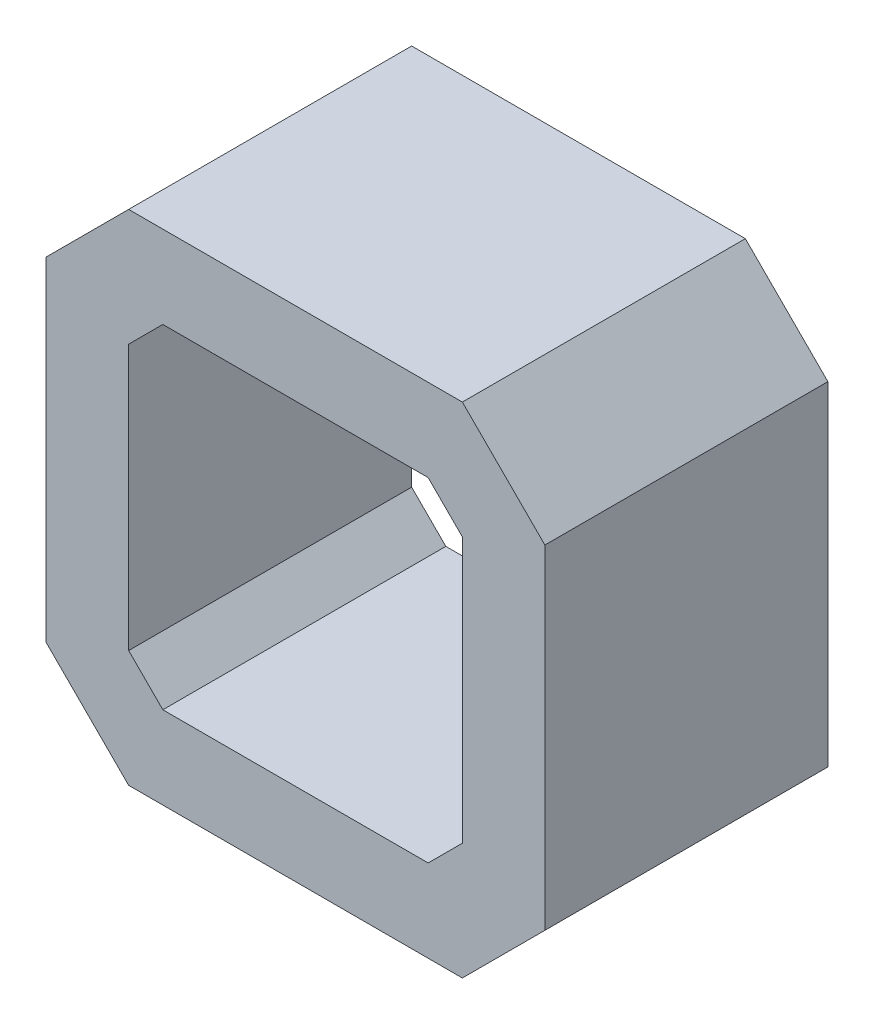
ISO-10303-21;
HEADER;
FILE_DESCRIPTION(('STEP AP214'),'2;1');
FILE_NAME('part.step','',(''),(''),'','','');
FILE_SCHEMA(('AUTOMOTIVE_DESIGN { 1 0 10303 214 1 1 1 1 }'));
ENDSEC;
DATA;
#1=APPLICATION_CONTEXT('core data for automotive mechanical design processes');
#2=APPLICATION_PROTOCOL_DEFINITION('international standard','automotive_design',2000,#1);
#3=PRODUCT_CONTEXT('',#1,'mechanical');
#4=PRODUCT('Part','Part','',(#3));
#5=PRODUCT_RELATED_PRODUCT_CATEGORY('part','',(#4));
#6=PRODUCT_DEFINITION_FORMATION('','',#4);
#7=PRODUCT_DEFINITION_CONTEXT('part definition',#1,'design');
#8=PRODUCT_DEFINITION('design','',#6,#7);
#9=PRODUCT_DEFINITION_SHAPE('','',#8);
#10=(LENGTH_UNIT() NAMED_UNIT(*) SI_UNIT(.MILLI.,.METRE.));
#11=(NAMED_UNIT(*) PLANE_ANGLE_UNIT() SI_UNIT($,.RADIAN.));
#12=(NAMED_UNIT(*) SI_UNIT($,.STERADIAN.) SOLID_ANGLE_UNIT());
#13=UNCERTAINTY_MEASURE_WITH_UNIT(LENGTH_MEASURE(1.E-05),#10,'distance_accuracy_value','');
#14=(GEOMETRIC_REPRESENTATION_CONTEXT(3) GLOBAL_UNCERTAINTY_ASSIGNED_CONTEXT((#13)) GLOBAL_UNIT_ASSIGNED_CONTEXT((#10,
#11,#12)) REPRESENTATION_CONTEXT('',''));
#15=CARTESIAN_POINT('',(0.,0.,0.));
#16=DIRECTION('',(0.,0.,1.));
#17=DIRECTION('',(1.,0.,0.));
#18=AXIS2_PLACEMENT_3D('',#15,#16,#17);
#19=CARTESIAN_POINT('',(-21.15,14.15,24.));
#20=DIRECTION('',(1.,0.,0.));
#21=DIRECTION('',(0.,0.,-1.));
#22=AXIS2_PLACEMENT_3D('',#19,#20,#21);
#23=PLANE('',#22);
#24=DIRECTION('',(0.,-1.,0.));
#25=VECTOR('',#24,1.);
#26=CARTESIAN_POINT('',(-21.15,14.15,0.));
#27=LINE('',#26,#25);
#28=CARTESIAN_POINT('',(-21.15,14.15,0.));
#29=VERTEX_POINT('',#28);
#30=CARTESIAN_POINT('',(-21.15,-14.15,0.));
#31=VERTEX_POINT('',#30);
#32=EDGE_CURVE('E219',#29,#31,#27,.T.);
#33=ORIENTED_EDGE('',*,*,#32,.T.);
#34=DIRECTION('',(0.,0.,-1.));
#35=VECTOR('',#34,1.);
#36=CARTESIAN_POINT('',(-21.15,-14.15,24.));
#37=LINE('',#36,#35);
#38=CARTESIAN_POINT('',(-21.15,-14.15,24.));
#39=VERTEX_POINT('',#38);
#40=EDGE_CURVE('E11',#39,#31,#37,.T.);
#41=ORIENTED_EDGE('',*,*,#40,.F.);
#42=DIRECTION('',(0.,-1.,0.));
#43=VECTOR('',#42,1.);
#44=CARTESIAN_POINT('',(-21.15,14.15,24.));
#45=LINE('',#44,#43);
#46=CARTESIAN_POINT('',(-21.15,14.15,24.));
#47=VERTEX_POINT('',#46);
#48=EDGE_CURVE('E200',#47,#39,#45,.T.);
#49=ORIENTED_EDGE('',*,*,#48,.F.);
#50=DIRECTION('',(0.,0.,-1.));
#51=VECTOR('',#50,1.);
#52=CARTESIAN_POINT('',(-21.15,14.15,24.));
#53=LINE('',#52,#51);
#54=EDGE_CURVE('E218',#47,#29,#53,.T.);
#55=ORIENTED_EDGE('',*,*,#54,.T.);
#56=EDGE_LOOP('',(#33,#41,#49,#55));
#57=FACE_BOUND('',#56,.T.);
#58=ADVANCED_FACE('F34',(#57),#23,.F.);
#59=CARTESIAN_POINT('',(-21.15,-14.15,24.));
#60=DIRECTION('',(0.707106781186548,0.707106781186548,0.));
#61=DIRECTION('',(-0.707106781186548,0.707106781186548,0.));
#62=AXIS2_PLACEMENT_3D('',#59,#60,#61);
#63=PLANE('',#62);
#64=DIRECTION('',(0.707106781186547,-0.707106781186547,0.));
#65=VECTOR('',#64,1.);
#66=CARTESIAN_POINT('',(-21.15,-14.15,0.));
#67=LINE('',#66,#65);
#68=CARTESIAN_POINT('',(-14.15,-21.15,0.));
#69=VERTEX_POINT('',#68);
#70=EDGE_CURVE('E222',#31,#69,#67,.T.);
#71=ORIENTED_EDGE('',*,*,#70,.T.);
#72=DIRECTION('',(0.,0.,-1.));
#73=VECTOR('',#72,1.);
#74=CARTESIAN_POINT('',(-14.15,-21.15,24.));
#75=LINE('',#74,#73);
#76=CARTESIAN_POINT('',(-14.15,-21.15,24.));
#77=VERTEX_POINT('',#76);
#78=EDGE_CURVE('E41',#77,#69,#75,.T.);
#79=ORIENTED_EDGE('',*,*,#78,.F.);
#80=DIRECTION('',(0.707106781186547,-0.707106781186547,0.));
#81=VECTOR('',#80,1.);
#82=CARTESIAN_POINT('',(-21.15,-14.15,24.));
#83=LINE('',#82,#81);
#84=EDGE_CURVE('E203',#39,#77,#83,.T.);
#85=ORIENTED_EDGE('',*,*,#84,.F.);
#86=ORIENTED_EDGE('',*,*,#40,.T.);
#87=EDGE_LOOP('',(#71,#79,#85,#86));
#88=FACE_BOUND('',#87,.T.);
#89=ADVANCED_FACE('F277',(#88),#63,.F.);
#90=CARTESIAN_POINT('',(-14.15,-21.15,24.));
#91=DIRECTION('',(0.,1.,0.));
#92=DIRECTION('',(0.,0.,1.));
#93=AXIS2_PLACEMENT_3D('',#90,#91,#92);
#94=PLANE('',#93);
#95=DIRECTION('',(1.,0.,0.));
#96=VECTOR('',#95,1.);
#97=CARTESIAN_POINT('',(-14.15,-21.15,0.));
#98=LINE('',#97,#96);
#99=CARTESIAN_POINT('',(14.15,-21.15,0.));
#100=VERTEX_POINT('',#99);
#101=EDGE_CURVE('E224',#69,#100,#98,.T.);
#102=ORIENTED_EDGE('',*,*,#101,.T.);
#103=DIRECTION('',(0.,0.,-1.));
#104=VECTOR('',#103,1.);
#105=CARTESIAN_POINT('',(14.15,-21.15,24.));
#106=LINE('',#105,#104);
#107=CARTESIAN_POINT('',(14.15,-21.15,24.));
#108=VERTEX_POINT('',#107);
#109=EDGE_CURVE('E249',#108,#100,#106,.T.);
#110=ORIENTED_EDGE('',*,*,#109,.F.);
#111=DIRECTION('',(1.,0.,0.));
#112=VECTOR('',#111,1.);
#113=CARTESIAN_POINT('',(-14.15,-21.15,24.));
#114=LINE('',#113,#112);
#115=EDGE_CURVE('E206',#77,#108,#114,.T.);
#116=ORIENTED_EDGE('',*,*,#115,.F.);
#117=ORIENTED_EDGE('',*,*,#78,.T.);
#118=EDGE_LOOP('',(#102,#110,#116,#117));
#119=FACE_BOUND('',#118,.T.);
#120=ADVANCED_FACE('F256',(#119),#94,.F.);
#121=CARTESIAN_POINT('',(21.15,-14.15,24.));
#122=DIRECTION('',(-0.707106781186548,0.707106781186548,0.));
#123=DIRECTION('',(-0.707106781186548,-0.707106781186548,0.));
#124=AXIS2_PLACEMENT_3D('',#121,#122,#123);
#125=PLANE('',#124);
#126=DIRECTION('',(0.707106781186547,0.707106781186547,0.));
#127=VECTOR('',#126,1.);
#128=CARTESIAN_POINT('',(21.15,-14.15,0.));
#129=LINE('',#128,#127);
#130=CARTESIAN_POINT('',(21.15,-14.15,0.));
#131=VERTEX_POINT('',#130);
#132=EDGE_CURVE('E226',#100,#131,#129,.T.);
#133=ORIENTED_EDGE('',*,*,#132,.T.);
#134=DIRECTION('',(0.,0.,-1.));
#135=VECTOR('',#134,1.);
#136=CARTESIAN_POINT('',(21.15,-14.15,24.));
#137=LINE('',#136,#135);
#138=CARTESIAN_POINT('',(21.15,-14.15,24.));
#139=VERTEX_POINT('',#138);
#140=EDGE_CURVE('E246',#139,#131,#137,.T.);
#141=ORIENTED_EDGE('',*,*,#140,.F.);
#142=DIRECTION('',(0.707106781186547,0.707106781186547,0.));
#143=VECTOR('',#142,1.);
#144=CARTESIAN_POINT('',(21.15,-14.15,24.));
#145=LINE('',#144,#143);
#146=EDGE_CURVE('E208',#108,#139,#145,.T.);
#147=ORIENTED_EDGE('',*,*,#146,.F.);
#148=ORIENTED_EDGE('',*,*,#109,.T.);
#149=EDGE_LOOP('',(#133,#141,#147,#148));
#150=FACE_BOUND('',#149,.T.);
#151=ADVANCED_FACE('F265',(#150),#125,.F.);
#152=CARTESIAN_POINT('',(21.15,14.15,24.));
#153=DIRECTION('',(-1.,0.,0.));
#154=DIRECTION('',(0.,-1.,0.));
#155=AXIS2_PLACEMENT_3D('',#152,#153,#154);
#156=PLANE('',#155);
#157=DIRECTION('',(0.,1.,0.));
#158=VECTOR('',#157,1.);
#159=CARTESIAN_POINT('',(21.15,14.15,0.));
#160=LINE('',#159,#158);
#161=CARTESIAN_POINT('',(21.15,14.15,0.));
#162=VERTEX_POINT('',#161);
#163=EDGE_CURVE('E228',#131,#162,#160,.T.);
#164=ORIENTED_EDGE('',*,*,#163,.T.);
#165=DIRECTION('',(0.,0.,-1.));
#166=VECTOR('',#165,1.);
#167=CARTESIAN_POINT('',(21.15,14.15,24.));
#168=LINE('',#167,#166);
#169=CARTESIAN_POINT('',(21.15,14.15,24.));
#170=VERTEX_POINT('',#169);
#171=EDGE_CURVE('E243',#170,#162,#168,.T.);
#172=ORIENTED_EDGE('',*,*,#171,.F.);
#173=DIRECTION('',(0.,1.,0.));
#174=VECTOR('',#173,1.);
#175=CARTESIAN_POINT('',(21.15,14.15,24.));
#176=LINE('',#175,#174);
#177=EDGE_CURVE('E210',#139,#170,#176,.T.);
#178=ORIENTED_EDGE('',*,*,#177,.F.);
#179=ORIENTED_EDGE('',*,*,#140,.T.);
#180=EDGE_LOOP('',(#164,#172,#178,#179));
#181=FACE_BOUND('',#180,.T.);
#182=ADVANCED_FACE('F269',(#181),#156,.F.);
#183=CARTESIAN_POINT('',(14.15,21.15,24.));
#184=DIRECTION('',(-0.707106781186548,-0.707106781186548,0.));
#185=DIRECTION('',(0.707106781186548,-0.707106781186548,0.));
#186=AXIS2_PLACEMENT_3D('',#183,#184,#185);
#187=PLANE('',#186);
#188=DIRECTION('',(-0.707106781186547,0.707106781186547,0.));
#189=VECTOR('',#188,1.);
#190=CARTESIAN_POINT('',(14.15,21.15,0.));
#191=LINE('',#190,#189);
#192=CARTESIAN_POINT('',(14.15,21.15,0.));
#193=VERTEX_POINT('',#192);
#194=EDGE_CURVE('E230',#162,#193,#191,.T.);
#195=ORIENTED_EDGE('',*,*,#194,.T.);
#196=DIRECTION('',(0.,0.,-1.));
#197=VECTOR('',#196,1.);
#198=CARTESIAN_POINT('',(14.15,21.15,24.));
#199=LINE('',#198,#197);
#200=CARTESIAN_POINT('',(14.15,21.15,24.));
#201=VERTEX_POINT('',#200);
#202=EDGE_CURVE('E240',#201,#193,#199,.T.);
#203=ORIENTED_EDGE('',*,*,#202,.F.);
#204=DIRECTION('',(-0.707106781186547,0.707106781186547,0.));
#205=VECTOR('',#204,1.);
#206=CARTESIAN_POINT('',(14.15,21.15,24.));
#207=LINE('',#206,#205);
#208=EDGE_CURVE('E212',#170,#201,#207,.T.);
#209=ORIENTED_EDGE('',*,*,#208,.F.);
#210=ORIENTED_EDGE('',*,*,#171,.T.);
#211=EDGE_LOOP('',(#195,#203,#209,#210));
#212=FACE_BOUND('',#211,.T.);
#213=ADVANCED_FACE('F290',(#212),#187,.F.);
#214=CARTESIAN_POINT('',(-14.15,21.15,24.));
#215=DIRECTION('',(0.,-1.,0.));
#216=DIRECTION('',(0.,0.,-1.));
#217=AXIS2_PLACEMENT_3D('',#214,#215,#216);
#218=PLANE('',#217);
#219=DIRECTION('',(-1.,0.,0.));
#220=VECTOR('',#219,1.);
#221=CARTESIAN_POINT('',(-14.15,21.15,0.));
#222=LINE('',#221,#220);
#223=CARTESIAN_POINT('',(-14.15,21.15,0.));
#224=VERTEX_POINT('',#223);
#225=EDGE_CURVE('E232',#193,#224,#222,.T.);
#226=ORIENTED_EDGE('',*,*,#225,.T.);
#227=DIRECTION('',(0.,0.,-1.));
#228=VECTOR('',#227,1.);
#229=CARTESIAN_POINT('',(-14.15,21.15,24.));
#230=LINE('',#229,#228);
#231=CARTESIAN_POINT('',(-14.15,21.15,24.));
#232=VERTEX_POINT('',#231);
#233=EDGE_CURVE('E237',#232,#224,#230,.T.);
#234=ORIENTED_EDGE('',*,*,#233,.F.);
#235=DIRECTION('',(-1.,0.,0.));
#236=VECTOR('',#235,1.);
#237=CARTESIAN_POINT('',(-14.15,21.15,24.));
#238=LINE('',#237,#236);
#239=EDGE_CURVE('E214',#201,#232,#238,.T.);
#240=ORIENTED_EDGE('',*,*,#239,.F.);
#241=ORIENTED_EDGE('',*,*,#202,.T.);
#242=EDGE_LOOP('',(#226,#234,#240,#241));
#243=FACE_BOUND('',#242,.T.);
#244=ADVANCED_FACE('F288',(#243),#218,.F.);
#245=CARTESIAN_POINT('',(-14.15,21.15,24.));
#246=DIRECTION('',(0.707106781186548,-0.707106781186548,0.));
#247=DIRECTION('',(0.707106781186548,0.707106781186548,0.));
#248=AXIS2_PLACEMENT_3D('',#245,#246,#247);
#249=PLANE('',#248);
#250=DIRECTION('',(-0.707106781186547,-0.707106781186547,0.));
#251=VECTOR('',#250,1.);
#252=CARTESIAN_POINT('',(-14.15,21.15,0.));
#253=LINE('',#252,#251);
#254=EDGE_CURVE('E204',#224,#29,#253,.T.);
#255=ORIENTED_EDGE('',*,*,#254,.T.);
#256=ORIENTED_EDGE('',*,*,#54,.F.);
#257=DIRECTION('',(-0.707106781186547,-0.707106781186547,0.));
#258=VECTOR('',#257,1.);
#259=CARTESIAN_POINT('',(-14.15,21.15,24.));
#260=LINE('',#259,#258);
#261=EDGE_CURVE('E216',#232,#47,#260,.T.);
#262=ORIENTED_EDGE('',*,*,#261,.F.);
#263=ORIENTED_EDGE('',*,*,#233,.T.);
#264=EDGE_LOOP('',(#255,#256,#262,#263));
#265=FACE_BOUND('',#264,.T.);
#266=ADVANCED_FACE('F283',(#265),#249,.F.);
#267=CARTESIAN_POINT('',(0.,0.,24.));
#268=DIRECTION('',(0.,0.,1.));
#269=DIRECTION('',(1.,0.,0.));
#270=AXIS2_PLACEMENT_3D('',#267,#268,#269);
#271=PLANE('',#270);
#272=DIRECTION('',(0.,-1.,0.));
#273=VECTOR('',#272,1.);
#274=CARTESIAN_POINT('',(-14.15,14.15,24.));
#275=LINE('',#274,#273);
#276=CARTESIAN_POINT('',(-14.15,11.2505050633883,24.));
#277=VERTEX_POINT('',#276);
#278=CARTESIAN_POINT('',(-14.15,-11.2505050633883,24.));
#279=VERTEX_POINT('',#278);
#280=EDGE_CURVE('E171',#277,#279,#275,.T.);
#281=ORIENTED_EDGE('',*,*,#280,.F.);
#282=DIRECTION('',(-0.707106781186548,-0.707106781186548,0.));
#283=VECTOR('',#282,1.);
#284=CARTESIAN_POINT('',(-9.20025253169417,16.2002525316942,24.));
#285=LINE('',#284,#283);
#286=CARTESIAN_POINT('',(-11.2505050633883,14.15,24.));
#287=VERTEX_POINT('',#286);
#288=EDGE_CURVE('E152',#287,#277,#285,.T.);
#289=ORIENTED_EDGE('',*,*,#288,.F.);
#290=DIRECTION('',(-1.,0.,0.));
#291=VECTOR('',#290,1.);
#292=CARTESIAN_POINT('',(-14.15,14.15,24.));
#293=LINE('',#292,#291);
#294=CARTESIAN_POINT('',(11.2505050633883,14.15,24.));
#295=VERTEX_POINT('',#294);
#296=EDGE_CURVE('E197',#295,#287,#293,.T.);
#297=ORIENTED_EDGE('',*,*,#296,.F.);
#298=DIRECTION('',(-0.707106781186548,0.707106781186548,0.));
#299=VECTOR('',#298,1.);
#300=CARTESIAN_POINT('',(9.20025253169416,16.2002525316942,24.));
#301=LINE('',#300,#299);
#302=CARTESIAN_POINT('',(14.15,11.2505050633883,24.));
#303=VERTEX_POINT('',#302);
#304=EDGE_CURVE('E195',#303,#295,#301,.T.);
#305=ORIENTED_EDGE('',*,*,#304,.F.);
#306=DIRECTION('',(0.,1.,0.));
#307=VECTOR('',#306,1.);
#308=CARTESIAN_POINT('',(14.15,14.15,24.));
#309=LINE('',#308,#307);
#310=CARTESIAN_POINT('',(14.15,-11.2505050633883,24.));
#311=VERTEX_POINT('',#310);
#312=EDGE_CURVE('E193',#311,#303,#309,.T.);
#313=ORIENTED_EDGE('',*,*,#312,.F.);
#314=DIRECTION('',(0.707106781186548,0.707106781186548,0.));
#315=VECTOR('',#314,1.);
#316=CARTESIAN_POINT('',(16.2002525316942,-9.20025253169417,24.));
#317=LINE('',#316,#315);
#318=CARTESIAN_POINT('',(11.2505050633883,-14.15,24.));
#319=VERTEX_POINT('',#318);
#320=EDGE_CURVE('E191',#319,#311,#317,.T.);
#321=ORIENTED_EDGE('',*,*,#320,.F.);
#322=DIRECTION('',(1.,0.,0.));
#323=VECTOR('',#322,1.);
#324=CARTESIAN_POINT('',(-14.15,-14.15,24.));
#325=LINE('',#324,#323);
#326=CARTESIAN_POINT('',(-11.2505050633883,-14.15,24.));
#327=VERTEX_POINT('',#326);
#328=EDGE_CURVE('E189',#327,#319,#325,.T.);
#329=ORIENTED_EDGE('',*,*,#328,.F.);
#330=DIRECTION('',(0.707106781186548,-0.707106781186548,0.));
#331=VECTOR('',#330,1.);
#332=CARTESIAN_POINT('',(-16.2002525316942,-9.20025253169417,24.));
#333=LINE('',#332,#331);
#334=EDGE_CURVE('E173',#279,#327,#333,.T.);
#335=ORIENTED_EDGE('',*,*,#334,.F.);
#336=EDGE_LOOP('',(#281,#289,#297,#305,#313,#321,#329,#335));
#337=FACE_BOUND('',#336,.T.);
#338=ORIENTED_EDGE('',*,*,#48,.T.);
#339=ORIENTED_EDGE('',*,*,#84,.T.);
#340=ORIENTED_EDGE('',*,*,#115,.T.);
#341=ORIENTED_EDGE('',*,*,#146,.T.);
#342=ORIENTED_EDGE('',*,*,#177,.T.);
#343=ORIENTED_EDGE('',*,*,#208,.T.);
#344=ORIENTED_EDGE('',*,*,#239,.T.);
#345=ORIENTED_EDGE('',*,*,#261,.T.);
#346=EDGE_LOOP('',(#338,#339,#340,#341,#342,#343,#344,#345));
#347=FACE_BOUND('',#346,.T.);
#348=ADVANCED_FACE('F273',(#337,#347),#271,.T.);
#349=CARTESIAN_POINT('',(0.,0.,0.));
#350=DIRECTION('',(0.,0.,1.));
#351=DIRECTION('',(1.,0.,0.));
#352=AXIS2_PLACEMENT_3D('',#349,#350,#351);
#353=PLANE('',#352);
#354=DIRECTION('',(-0.707106781186548,-0.707106781186548,0.));
#355=VECTOR('',#354,1.);
#356=CARTESIAN_POINT('',(-9.20025253169417,16.2002525316942,0.));
#357=LINE('',#356,#355);
#358=CARTESIAN_POINT('',(-11.2505050633883,14.15,0.));
#359=VERTEX_POINT('',#358);
#360=CARTESIAN_POINT('',(-14.15,11.2505050633883,0.));
#361=VERTEX_POINT('',#360);
#362=EDGE_CURVE('E149',#359,#361,#357,.T.);
#363=ORIENTED_EDGE('',*,*,#362,.T.);
#364=DIRECTION('',(0.,-1.,0.));
#365=VECTOR('',#364,1.);
#366=CARTESIAN_POINT('',(-14.15,14.15,0.));
#367=LINE('',#366,#365);
#368=CARTESIAN_POINT('',(-14.15,-11.2505050633883,0.));
#369=VERTEX_POINT('',#368);
#370=EDGE_CURVE('E158',#361,#369,#367,.T.);
#371=ORIENTED_EDGE('',*,*,#370,.T.);
#372=DIRECTION('',(0.707106781186548,-0.707106781186548,0.));
#373=VECTOR('',#372,1.);
#374=CARTESIAN_POINT('',(-16.2002525316942,-9.20025253169417,0.));
#375=LINE('',#374,#373);
#376=CARTESIAN_POINT('',(-11.2505050633883,-14.15,0.));
#377=VERTEX_POINT('',#376);
#378=EDGE_CURVE('E164',#369,#377,#375,.T.);
#379=ORIENTED_EDGE('',*,*,#378,.T.);
#380=DIRECTION('',(1.,0.,0.));
#381=VECTOR('',#380,1.);
#382=CARTESIAN_POINT('',(-14.15,-14.15,0.));
#383=LINE('',#382,#381);
#384=CARTESIAN_POINT('',(11.2505050633883,-14.15,0.));
#385=VERTEX_POINT('',#384);
#386=EDGE_CURVE('E56',#377,#385,#383,.T.);
#387=ORIENTED_EDGE('',*,*,#386,.T.);
#388=DIRECTION('',(0.707106781186548,0.707106781186548,0.));
#389=VECTOR('',#388,1.);
#390=CARTESIAN_POINT('',(16.2002525316942,-9.20025253169417,0.));
#391=LINE('',#390,#389);
#392=CARTESIAN_POINT('',(14.15,-11.2505050633883,0.));
#393=VERTEX_POINT('',#392);
#394=EDGE_CURVE('E183',#385,#393,#391,.T.);
#395=ORIENTED_EDGE('',*,*,#394,.T.);
#396=DIRECTION('',(0.,1.,0.));
#397=VECTOR('',#396,1.);
#398=CARTESIAN_POINT('',(14.15,14.15,0.));
#399=LINE('',#398,#397);
#400=CARTESIAN_POINT('',(14.15,11.2505050633883,0.));
#401=VERTEX_POINT('',#400);
#402=EDGE_CURVE('E180',#393,#401,#399,.T.);
#403=ORIENTED_EDGE('',*,*,#402,.T.);
#404=DIRECTION('',(-0.707106781186548,0.707106781186548,0.));
#405=VECTOR('',#404,1.);
#406=CARTESIAN_POINT('',(9.20025253169416,16.2002525316942,0.));
#407=LINE('',#406,#405);
#408=CARTESIAN_POINT('',(11.2505050633883,14.15,0.));
#409=VERTEX_POINT('',#408);
#410=EDGE_CURVE('E175',#401,#409,#407,.T.);
#411=ORIENTED_EDGE('',*,*,#410,.T.);
#412=DIRECTION('',(-1.,0.,0.));
#413=VECTOR('',#412,1.);
#414=CARTESIAN_POINT('',(-14.15,14.15,0.));
#415=LINE('',#414,#413);
#416=EDGE_CURVE('E170',#409,#359,#415,.T.);
#417=ORIENTED_EDGE('',*,*,#416,.T.);
#418=EDGE_LOOP('',(#363,#371,#379,#387,#395,#403,#411,#417));
#419=FACE_BOUND('',#418,.T.);
#420=ORIENTED_EDGE('',*,*,#32,.F.);
#421=ORIENTED_EDGE('',*,*,#254,.F.);
#422=ORIENTED_EDGE('',*,*,#225,.F.);
#423=ORIENTED_EDGE('',*,*,#194,.F.);
#424=ORIENTED_EDGE('',*,*,#163,.F.);
#425=ORIENTED_EDGE('',*,*,#132,.F.);
#426=ORIENTED_EDGE('',*,*,#101,.F.);
#427=ORIENTED_EDGE('',*,*,#70,.F.);
#428=EDGE_LOOP('',(#420,#421,#422,#423,#424,#425,#426,#427));
#429=FACE_BOUND('',#428,.T.);
#430=ADVANCED_FACE('F166',(#419,#429),#353,.F.);
#431=CARTESIAN_POINT('',(-14.15,14.15,24.));
#432=DIRECTION('',(1.,0.,0.));
#433=DIRECTION('',(0.,0.,-1.));
#434=AXIS2_PLACEMENT_3D('',#431,#432,#433);
#435=PLANE('',#434);
#436=ORIENTED_EDGE('',*,*,#370,.F.);
#437=DIRECTION('',(0.,0.,-1.));
#438=VECTOR('',#437,1.);
#439=CARTESIAN_POINT('',(-14.15,11.2505050633883,24.));
#440=LINE('',#439,#438);
#441=EDGE_CURVE('E145',#277,#361,#440,.T.);
#442=ORIENTED_EDGE('',*,*,#441,.F.);
#443=ORIENTED_EDGE('',*,*,#280,.T.);
#444=DIRECTION('',(0.,0.,-1.));
#445=VECTOR('',#444,1.);
#446=CARTESIAN_POINT('',(-14.15,-11.2505050633883,24.));
#447=LINE('',#446,#445);
#448=EDGE_CURVE('E161',#279,#369,#447,.T.);
#449=ORIENTED_EDGE('',*,*,#448,.T.);
#450=EDGE_LOOP('',(#436,#442,#443,#449));
#451=FACE_BOUND('',#450,.T.);
#452=ADVANCED_FACE('F159',(#451),#435,.T.);
#453=CARTESIAN_POINT('',(-16.2002525316942,-9.20025253169417,24.));
#454=DIRECTION('',(0.707106781186548,0.707106781186548,0.));
#455=DIRECTION('',(-0.707106781186548,0.707106781186548,0.));
#456=AXIS2_PLACEMENT_3D('',#453,#454,#455);
#457=PLANE('',#456);
#458=ORIENTED_EDGE('',*,*,#378,.F.);
#459=ORIENTED_EDGE('',*,*,#448,.F.);
#460=ORIENTED_EDGE('',*,*,#334,.T.);
#461=DIRECTION('',(0.,0.,-1.));
#462=VECTOR('',#461,1.);
#463=CARTESIAN_POINT('',(-11.2505050633883,-14.15,24.));
#464=LINE('',#463,#462);
#465=EDGE_CURVE('E446',#327,#377,#464,.T.);
#466=ORIENTED_EDGE('',*,*,#465,.T.);
#467=EDGE_LOOP('',(#458,#459,#460,#466));
#468=FACE_BOUND('',#467,.T.);
#469=ADVANCED_FACE('F361',(#468),#457,.T.);
#470=CARTESIAN_POINT('',(-14.15,-14.15,24.));
#471=DIRECTION('',(0.,1.,0.));
#472=DIRECTION('',(0.,0.,1.));
#473=AXIS2_PLACEMENT_3D('',#470,#471,#472);
#474=PLANE('',#473);
#475=ORIENTED_EDGE('',*,*,#386,.F.);
#476=ORIENTED_EDGE('',*,*,#465,.F.);
#477=ORIENTED_EDGE('',*,*,#328,.T.);
#478=DIRECTION('',(0.,0.,-1.));
#479=VECTOR('',#478,1.);
#480=CARTESIAN_POINT('',(11.2505050633883,-14.15,24.));
#481=LINE('',#480,#479);
#482=EDGE_CURVE('E444',#319,#385,#481,.T.);
#483=ORIENTED_EDGE('',*,*,#482,.T.);
#484=EDGE_LOOP('',(#475,#476,#477,#483));
#485=FACE_BOUND('',#484,.T.);
#486=ADVANCED_FACE('F370',(#485),#474,.T.);
#487=CARTESIAN_POINT('',(16.2002525316942,-9.20025253169417,24.));
#488=DIRECTION('',(-0.707106781186548,0.707106781186548,0.));
#489=DIRECTION('',(-0.707106781186548,-0.707106781186548,0.));
#490=AXIS2_PLACEMENT_3D('',#487,#488,#489);
#491=PLANE('',#490);
#492=ORIENTED_EDGE('',*,*,#394,.F.);
#493=ORIENTED_EDGE('',*,*,#482,.F.);
#494=ORIENTED_EDGE('',*,*,#320,.T.);
#495=DIRECTION('',(0.,0.,-1.));
#496=VECTOR('',#495,1.);
#497=CARTESIAN_POINT('',(14.15,-11.2505050633883,24.));
#498=LINE('',#497,#496);
#499=EDGE_CURVE('E440',#311,#393,#498,.T.);
#500=ORIENTED_EDGE('',*,*,#499,.T.);
#501=EDGE_LOOP('',(#492,#493,#494,#500));
#502=FACE_BOUND('',#501,.T.);
#503=ADVANCED_FACE('F380',(#502),#491,.T.);
#504=CARTESIAN_POINT('',(14.15,14.15,24.));
#505=DIRECTION('',(-1.,0.,0.));
#506=DIRECTION('',(0.,-1.,0.));
#507=AXIS2_PLACEMENT_3D('',#504,#505,#506);
#508=PLANE('',#507);
#509=ORIENTED_EDGE('',*,*,#402,.F.);
#510=ORIENTED_EDGE('',*,*,#499,.F.);
#511=ORIENTED_EDGE('',*,*,#312,.T.);
#512=DIRECTION('',(0.,0.,-1.));
#513=VECTOR('',#512,1.);
#514=CARTESIAN_POINT('',(14.15,11.2505050633883,24.));
#515=LINE('',#514,#513);
#516=EDGE_CURVE('E437',#303,#401,#515,.T.);
#517=ORIENTED_EDGE('',*,*,#516,.T.);
#518=EDGE_LOOP('',(#509,#510,#511,#517));
#519=FACE_BOUND('',#518,.T.);
#520=ADVANCED_FACE('F389',(#519),#508,.T.);
#521=CARTESIAN_POINT('',(9.20025253169416,16.2002525316942,24.));
#522=DIRECTION('',(-0.707106781186548,-0.707106781186548,0.));
#523=DIRECTION('',(0.707106781186548,-0.707106781186548,0.));
#524=AXIS2_PLACEMENT_3D('',#521,#522,#523);
#525=PLANE('',#524);
#526=ORIENTED_EDGE('',*,*,#410,.F.);
#527=ORIENTED_EDGE('',*,*,#516,.F.);
#528=ORIENTED_EDGE('',*,*,#304,.T.);
#529=DIRECTION('',(0.,0.,-1.));
#530=VECTOR('',#529,1.);
#531=CARTESIAN_POINT('',(11.2505050633883,14.15,24.));
#532=LINE('',#531,#530);
#533=EDGE_CURVE('E432',#295,#409,#532,.T.);
#534=ORIENTED_EDGE('',*,*,#533,.T.);
#535=EDGE_LOOP('',(#526,#527,#528,#534));
#536=FACE_BOUND('',#535,.T.);
#537=ADVANCED_FACE('F399',(#536),#525,.T.);
#538=CARTESIAN_POINT('',(-14.15,14.15,24.));
#539=DIRECTION('',(0.,-1.,0.));
#540=DIRECTION('',(0.,0.,-1.));
#541=AXIS2_PLACEMENT_3D('',#538,#539,#540);
#542=PLANE('',#541);
#543=ORIENTED_EDGE('',*,*,#416,.F.);
#544=ORIENTED_EDGE('',*,*,#533,.F.);
#545=ORIENTED_EDGE('',*,*,#296,.T.);
#546=DIRECTION('',(0.,0.,-1.));
#547=VECTOR('',#546,1.);
#548=CARTESIAN_POINT('',(-11.2505050633883,14.15,24.));
#549=LINE('',#548,#547);
#550=EDGE_CURVE('E48',#287,#359,#549,.T.);
#551=ORIENTED_EDGE('',*,*,#550,.T.);
#552=EDGE_LOOP('',(#543,#544,#545,#551));
#553=FACE_BOUND('',#552,.T.);
#554=ADVANCED_FACE('F409',(#553),#542,.T.);
#555=CARTESIAN_POINT('',(-9.20025253169417,16.2002525316942,24.));
#556=DIRECTION('',(0.707106781186548,-0.707106781186548,0.));
#557=DIRECTION('',(0.707106781186548,0.707106781186548,0.));
#558=AXIS2_PLACEMENT_3D('',#555,#556,#557);
#559=PLANE('',#558);
#560=ORIENTED_EDGE('',*,*,#362,.F.);
#561=ORIENTED_EDGE('',*,*,#550,.F.);
#562=ORIENTED_EDGE('',*,*,#288,.T.);
#563=ORIENTED_EDGE('',*,*,#441,.T.);
#564=EDGE_LOOP('',(#560,#561,#562,#563));
#565=FACE_BOUND('',#564,.T.);
#566=ADVANCED_FACE('F147',(#565),#559,.T.);
#567=CLOSED_SHELL('',(#58,#89,#120,#151,#182,#213,#244,#266,#348,#430,#452,#469,#486,#503,#520,
#537,#554,#566));
#568=MANIFOLD_SOLID_BREP('B2',#567);
#569=ADVANCED_BREP_SHAPE_REPRESENTATION('',(#18,#568),#14);
#570=SHAPE_DEFINITION_REPRESENTATION(#9,#569);
ENDSEC;
END-ISO-10303-21;
